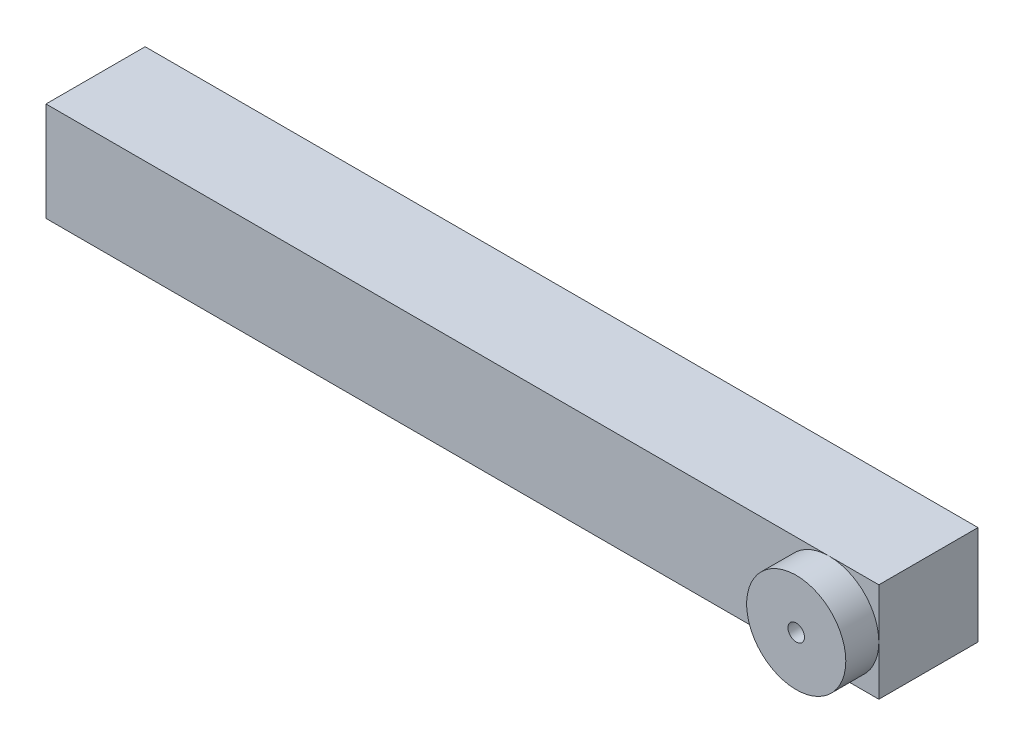
ISO-10303-21;
HEADER;
FILE_DESCRIPTION(('STEP AP214'),'2;1');
FILE_NAME('part.step','',(''),(''),'','','');
FILE_SCHEMA(('AUTOMOTIVE_DESIGN { 1 0 10303 214 1 1 1 1 }'));
ENDSEC;
DATA;
#1=APPLICATION_CONTEXT('core data for automotive mechanical design processes');
#2=APPLICATION_PROTOCOL_DEFINITION('international standard','automotive_design',2000,#1);
#3=PRODUCT_CONTEXT('',#1,'mechanical');
#4=PRODUCT('Part','Part','',(#3));
#5=PRODUCT_RELATED_PRODUCT_CATEGORY('part','',(#4));
#6=PRODUCT_DEFINITION_FORMATION('','',#4);
#7=PRODUCT_DEFINITION_CONTEXT('part definition',#1,'design');
#8=PRODUCT_DEFINITION('design','',#6,#7);
#9=PRODUCT_DEFINITION_SHAPE('','',#8);
#10=(LENGTH_UNIT() NAMED_UNIT(*) SI_UNIT(.MILLI.,.METRE.));
#11=(NAMED_UNIT(*) PLANE_ANGLE_UNIT() SI_UNIT($,.RADIAN.));
#12=(NAMED_UNIT(*) SI_UNIT($,.STERADIAN.) SOLID_ANGLE_UNIT());
#13=UNCERTAINTY_MEASURE_WITH_UNIT(LENGTH_MEASURE(1.E-05),#10,'distance_accuracy_value','');
#14=(GEOMETRIC_REPRESENTATION_CONTEXT(3) GLOBAL_UNCERTAINTY_ASSIGNED_CONTEXT((#13)) GLOBAL_UNIT_ASSIGNED_CONTEXT((#10,
#11,#12)) REPRESENTATION_CONTEXT('',''));
#15=CARTESIAN_POINT('',(0.,0.,0.));
#16=DIRECTION('',(0.,0.,1.));
#17=DIRECTION('',(1.,0.,0.));
#18=AXIS2_PLACEMENT_3D('',#15,#16,#17);
#19=CARTESIAN_POINT('',(252.,0.,0.));
#20=DIRECTION('',(0.,0.,-1.));
#21=DIRECTION('',(-1.,0.,0.));
#22=AXIS2_PLACEMENT_3D('',#19,#20,#21);
#23=PLANE('',#22);
#24=CARTESIAN_POINT('',(237.,15.,0.));
#25=DIRECTION('',(0.,0.,1.));
#26=DIRECTION('',(1.,0.,0.));
#27=AXIS2_PLACEMENT_3D('',#24,#25,#26);
#28=CIRCLE('',#27,15.);
#29=CARTESIAN_POINT('',(252.,15.,0.));
#30=VERTEX_POINT('',#29);
#31=CARTESIAN_POINT('',(237.,30.,0.));
#32=VERTEX_POINT('',#31);
#33=EDGE_CURVE('E57',#30,#32,#28,.T.);
#34=ORIENTED_EDGE('',*,*,#33,.F.);
#35=DIRECTION('',(0.,-1.,0.));
#36=VECTOR('',#35,1.);
#37=CARTESIAN_POINT('',(252.,0.,0.));
#38=LINE('',#37,#36);
#39=CARTESIAN_POINT('',(252.,30.,0.));
#40=VERTEX_POINT('',#39);
#41=EDGE_CURVE('E97',#40,#30,#38,.T.);
#42=ORIENTED_EDGE('',*,*,#41,.F.);
#43=DIRECTION('',(-1.,0.,0.));
#44=VECTOR('',#43,1.);
#45=CARTESIAN_POINT('',(252.,30.,0.));
#46=LINE('',#45,#44);
#47=EDGE_CURVE('E114',#40,#32,#46,.T.);
#48=ORIENTED_EDGE('',*,*,#47,.T.);
#49=EDGE_LOOP('',(#34,#42,#48));
#50=FACE_BOUND('',#49,.T.);
#51=ADVANCED_FACE('F45',(#50),#23,.F.);
#52=CARTESIAN_POINT('',(237.,0.,0.));
#53=VERTEX_POINT('',#52);
#54=EDGE_CURVE('E11',#32,#53,#28,.T.);
#55=ORIENTED_EDGE('',*,*,#54,.F.);
#56=CARTESIAN_POINT('',(0.,30.,0.));
#57=VERTEX_POINT('',#56);
#58=EDGE_CURVE('E133',#32,#57,#46,.T.);
#59=ORIENTED_EDGE('',*,*,#58,.T.);
#60=DIRECTION('',(0.,-1.,0.));
#61=VECTOR('',#60,1.);
#62=CARTESIAN_POINT('',(0.,0.,0.));
#63=LINE('',#62,#61);
#64=CARTESIAN_POINT('',(0.,0.,0.));
#65=VERTEX_POINT('',#64);
#66=EDGE_CURVE('E134',#57,#65,#63,.T.);
#67=ORIENTED_EDGE('',*,*,#66,.T.);
#68=DIRECTION('',(-1.,0.,0.));
#69=VECTOR('',#68,1.);
#70=CARTESIAN_POINT('',(252.,0.,0.));
#71=LINE('',#70,#69);
#72=EDGE_CURVE('E122',#53,#65,#71,.T.);
#73=ORIENTED_EDGE('',*,*,#72,.F.);
#74=EDGE_LOOP('',(#55,#59,#67,#73));
#75=FACE_BOUND('',#74,.T.);
#76=ADVANCED_FACE('F167',(#75),#23,.F.);
#77=EDGE_CURVE('E55',#53,#30,#28,.T.);
#78=ORIENTED_EDGE('',*,*,#77,.F.);
#79=CARTESIAN_POINT('',(252.,0.,0.));
#80=VERTEX_POINT('',#79);
#81=EDGE_CURVE('E49',#80,#53,#71,.T.);
#82=ORIENTED_EDGE('',*,*,#81,.F.);
#83=EDGE_CURVE('E99',#30,#80,#38,.T.);
#84=ORIENTED_EDGE('',*,*,#83,.F.);
#85=EDGE_LOOP('',(#78,#82,#84));
#86=FACE_BOUND('',#85,.T.);
#87=ADVANCED_FACE('F47',(#86),#23,.F.);
#88=CARTESIAN_POINT('',(252.,0.,0.));
#89=DIRECTION('',(0.,1.,0.));
#90=DIRECTION('',(0.,0.,1.));
#91=AXIS2_PLACEMENT_3D('',#88,#89,#90);
#92=PLANE('',#91);
#93=DIRECTION('',(0.,0.,-1.));
#94=VECTOR('',#93,1.);
#95=CARTESIAN_POINT('',(0.,0.,0.));
#96=LINE('',#95,#94);
#97=CARTESIAN_POINT('',(0.,0.,-30.));
#98=VERTEX_POINT('',#97);
#99=EDGE_CURVE('E138',#65,#98,#96,.T.);
#100=ORIENTED_EDGE('',*,*,#99,.T.);
#101=DIRECTION('',(-1.,0.,0.));
#102=VECTOR('',#101,1.);
#103=CARTESIAN_POINT('',(252.,0.,-30.));
#104=LINE('',#103,#102);
#105=CARTESIAN_POINT('',(252.,0.,-30.));
#106=VERTEX_POINT('',#105);
#107=EDGE_CURVE('E152',#106,#98,#104,.T.);
#108=ORIENTED_EDGE('',*,*,#107,.F.);
#109=DIRECTION('',(0.,0.,-1.));
#110=VECTOR('',#109,1.);
#111=CARTESIAN_POINT('',(252.,0.,0.));
#112=LINE('',#111,#110);
#113=EDGE_CURVE('E108',#80,#106,#112,.T.);
#114=ORIENTED_EDGE('',*,*,#113,.F.);
#115=ORIENTED_EDGE('',*,*,#81,.T.);
#116=ORIENTED_EDGE('',*,*,#72,.T.);
#117=EDGE_LOOP('',(#100,#108,#114,#115,#116));
#118=FACE_BOUND('',#117,.T.);
#119=ADVANCED_FACE('F162',(#118),#92,.F.);
#120=CARTESIAN_POINT('',(252.,0.,-30.));
#121=DIRECTION('',(0.,0.,1.));
#122=DIRECTION('',(1.,0.,0.));
#123=AXIS2_PLACEMENT_3D('',#120,#121,#122);
#124=PLANE('',#123);
#125=DIRECTION('',(0.,1.,0.));
#126=VECTOR('',#125,1.);
#127=CARTESIAN_POINT('',(0.,0.,-30.));
#128=LINE('',#127,#126);
#129=CARTESIAN_POINT('',(0.,30.,-30.));
#130=VERTEX_POINT('',#129);
#131=EDGE_CURVE('E141',#98,#130,#128,.T.);
#132=ORIENTED_EDGE('',*,*,#131,.T.);
#133=DIRECTION('',(-1.,0.,0.));
#134=VECTOR('',#133,1.);
#135=CARTESIAN_POINT('',(252.,30.,-30.));
#136=LINE('',#135,#134);
#137=CARTESIAN_POINT('',(252.,30.,-30.));
#138=VERTEX_POINT('',#137);
#139=EDGE_CURVE('E149',#138,#130,#136,.T.);
#140=ORIENTED_EDGE('',*,*,#139,.F.);
#141=DIRECTION('',(0.,1.,0.));
#142=VECTOR('',#141,1.);
#143=CARTESIAN_POINT('',(252.,0.,-30.));
#144=LINE('',#143,#142);
#145=EDGE_CURVE('E128',#106,#138,#144,.T.);
#146=ORIENTED_EDGE('',*,*,#145,.F.);
#147=ORIENTED_EDGE('',*,*,#107,.T.);
#148=EDGE_LOOP('',(#132,#140,#146,#147));
#149=FACE_BOUND('',#148,.T.);
#150=ADVANCED_FACE('F172',(#149),#124,.F.);
#151=CARTESIAN_POINT('',(252.,30.,0.));
#152=DIRECTION('',(0.,-1.,0.));
#153=DIRECTION('',(0.,0.,-1.));
#154=AXIS2_PLACEMENT_3D('',#151,#152,#153);
#155=PLANE('',#154);
#156=DIRECTION('',(0.,0.,1.));
#157=VECTOR('',#156,1.);
#158=CARTESIAN_POINT('',(0.,30.,0.));
#159=LINE('',#158,#157);
#160=EDGE_CURVE('E112',#130,#57,#159,.T.);
#161=ORIENTED_EDGE('',*,*,#160,.T.);
#162=ORIENTED_EDGE('',*,*,#58,.F.);
#163=ORIENTED_EDGE('',*,*,#47,.F.);
#164=DIRECTION('',(0.,0.,1.));
#165=VECTOR('',#164,1.);
#166=CARTESIAN_POINT('',(252.,30.,0.));
#167=LINE('',#166,#165);
#168=EDGE_CURVE('E102',#138,#40,#167,.T.);
#169=ORIENTED_EDGE('',*,*,#168,.F.);
#170=ORIENTED_EDGE('',*,*,#139,.T.);
#171=EDGE_LOOP('',(#161,#162,#163,#169,#170));
#172=FACE_BOUND('',#171,.T.);
#173=ADVANCED_FACE('F170',(#172),#155,.F.);
#174=CARTESIAN_POINT('',(252.,0.,0.));
#175=DIRECTION('',(-1.,0.,0.));
#176=DIRECTION('',(0.,0.,1.));
#177=AXIS2_PLACEMENT_3D('',#174,#175,#176);
#178=PLANE('',#177);
#179=ORIENTED_EDGE('',*,*,#41,.T.);
#180=ORIENTED_EDGE('',*,*,#83,.T.);
#181=ORIENTED_EDGE('',*,*,#113,.T.);
#182=ORIENTED_EDGE('',*,*,#145,.T.);
#183=ORIENTED_EDGE('',*,*,#168,.T.);
#184=EDGE_LOOP('',(#179,#180,#181,#182,#183));
#185=FACE_BOUND('',#184,.T.);
#186=ADVANCED_FACE('F98',(#185),#178,.F.);
#187=CARTESIAN_POINT('',(0.,0.,0.));
#188=DIRECTION('',(-1.,0.,0.));
#189=DIRECTION('',(0.,0.,1.));
#190=AXIS2_PLACEMENT_3D('',#187,#188,#189);
#191=PLANE('',#190);
#192=ORIENTED_EDGE('',*,*,#66,.F.);
#193=ORIENTED_EDGE('',*,*,#160,.F.);
#194=ORIENTED_EDGE('',*,*,#131,.F.);
#195=ORIENTED_EDGE('',*,*,#99,.F.);
#196=EDGE_LOOP('',(#192,#193,#194,#195));
#197=FACE_BOUND('',#196,.T.);
#198=ADVANCED_FACE('F165',(#197),#191,.T.);
#199=CARTESIAN_POINT('',(237.,15.,10.));
#200=DIRECTION('',(0.,0.,-1.));
#201=DIRECTION('',(-1.,0.,0.));
#202=AXIS2_PLACEMENT_3D('',#199,#200,#201);
#203=CYLINDRICAL_SURFACE('',#202,15.);
#204=CARTESIAN_POINT('',(237.,15.,10.));
#205=DIRECTION('',(0.,0.,1.));
#206=DIRECTION('',(1.,0.,0.));
#207=AXIS2_PLACEMENT_3D('',#204,#205,#206);
#208=CIRCLE('',#207,15.);
#209=CARTESIAN_POINT('',(252.,15.,10.));
#210=VERTEX_POINT('',#209);
#211=EDGE_CURVE('E117',#210,#210,#208,.T.);
#212=ORIENTED_EDGE('',*,*,#211,.F.);
#213=EDGE_LOOP('',(#212));
#214=FACE_BOUND('',#213,.T.);
#215=ORIENTED_EDGE('',*,*,#33,.T.);
#216=ORIENTED_EDGE('',*,*,#54,.T.);
#217=ORIENTED_EDGE('',*,*,#77,.T.);
#218=EDGE_LOOP('',(#215,#216,#217));
#219=FACE_BOUND('',#218,.T.);
#220=ADVANCED_FACE('F119',(#214,#219),#203,.T.);
#221=CARTESIAN_POINT('',(237.,15.,10.));
#222=DIRECTION('',(0.,0.,1.));
#223=DIRECTION('',(1.,0.,0.));
#224=AXIS2_PLACEMENT_3D('',#221,#222,#223);
#225=PLANE('',#224);
#226=CARTESIAN_POINT('',(237.,15.,10.));
#227=DIRECTION('',(0.,0.,1.));
#228=DIRECTION('',(1.,0.,0.));
#229=AXIS2_PLACEMENT_3D('',#226,#227,#228);
#230=CIRCLE('',#229,2.5);
#231=CARTESIAN_POINT('',(239.5,15.,10.));
#232=VERTEX_POINT('',#231);
#233=EDGE_CURVE('E275',#232,#232,#230,.T.);
#234=ORIENTED_EDGE('',*,*,#233,.F.);
#235=EDGE_LOOP('',(#234));
#236=FACE_BOUND('',#235,.T.);
#237=ORIENTED_EDGE('',*,*,#211,.T.);
#238=EDGE_LOOP('',(#237));
#239=FACE_BOUND('',#238,.T.);
#240=ADVANCED_FACE('F215',(#236,#239),#225,.T.);
#241=CARTESIAN_POINT('',(237.,15.,6.));
#242=DIRECTION('',(0.,0.,1.));
#243=DIRECTION('',(1.,0.,0.));
#244=AXIS2_PLACEMENT_3D('',#241,#242,#243);
#245=CYLINDRICAL_SURFACE('',#244,2.5);
#246=CARTESIAN_POINT('',(237.,15.,6.));
#247=DIRECTION('',(0.,0.,1.));
#248=DIRECTION('',(1.,0.,0.));
#249=AXIS2_PLACEMENT_3D('',#246,#247,#248);
#250=CIRCLE('',#249,2.5);
#251=CARTESIAN_POINT('',(239.5,15.,6.));
#252=VERTEX_POINT('',#251);
#253=EDGE_CURVE('E118',#252,#252,#250,.T.);
#254=ORIENTED_EDGE('',*,*,#253,.F.);
#255=EDGE_LOOP('',(#254));
#256=FACE_BOUND('',#255,.T.);
#257=ORIENTED_EDGE('',*,*,#233,.T.);
#258=EDGE_LOOP('',(#257));
#259=FACE_BOUND('',#258,.T.);
#260=ADVANCED_FACE('F224',(#256,#259),#245,.F.);
#261=CARTESIAN_POINT('',(237.,15.,6.));
#262=DIRECTION('',(0.,0.,1.));
#263=DIRECTION('',(1.,0.,0.));
#264=AXIS2_PLACEMENT_3D('',#261,#262,#263);
#265=PLANE('',#264);
#266=ORIENTED_EDGE('',*,*,#253,.T.);
#267=EDGE_LOOP('',(#266));
#268=FACE_BOUND('',#267,.T.);
#269=ADVANCED_FACE('F233',(#268),#265,.T.);
#270=CLOSED_SHELL('',(#51,#76,#87,#119,#150,#173,#186,#198,#220,#240,#260,#269));
#271=MANIFOLD_SOLID_BREP('B2',#270);
#272=ADVANCED_BREP_SHAPE_REPRESENTATION('',(#18,#271),#14);
#273=SHAPE_DEFINITION_REPRESENTATION(#9,#272);
ENDSEC;
END-ISO-10303-21;
